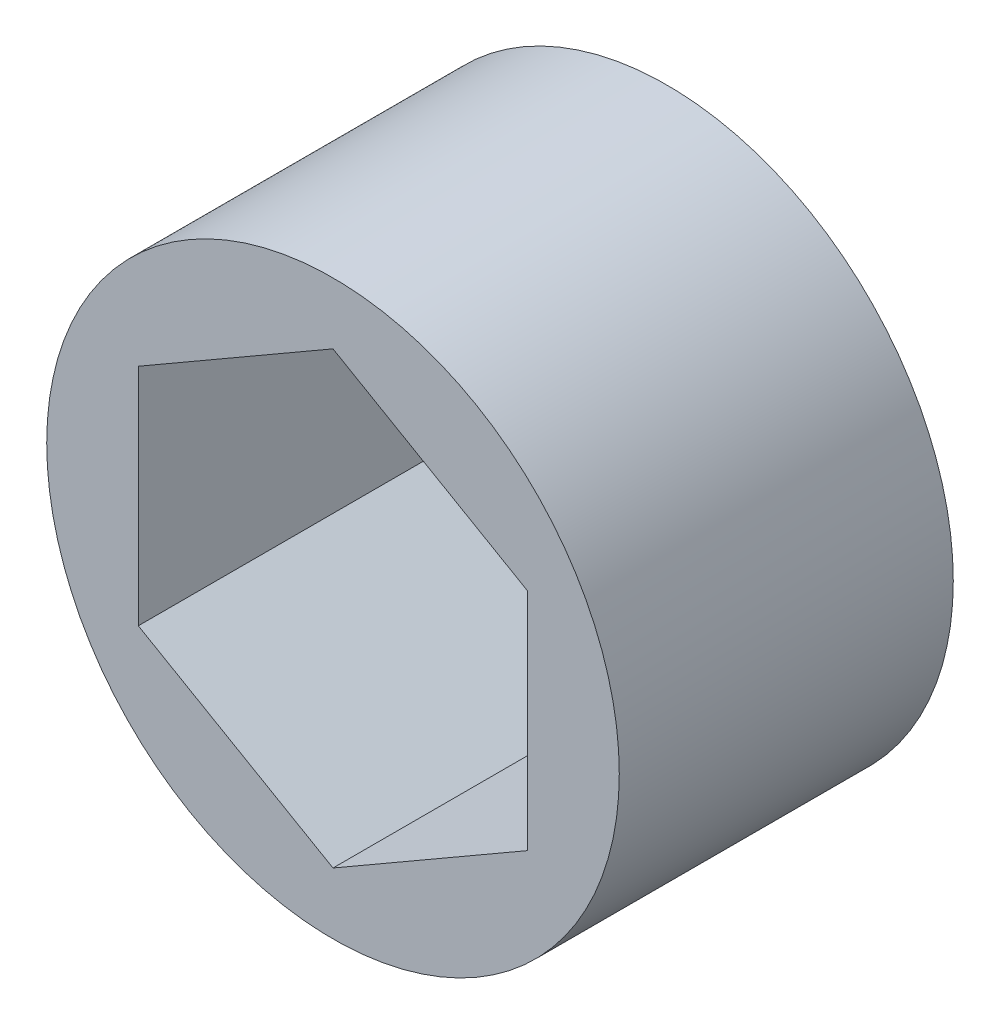
ISO-10303-21;
HEADER;
FILE_DESCRIPTION(('STEP AP214'),'2;1');
FILE_NAME('part.step','',(''),(''),'','','');
FILE_SCHEMA(('AUTOMOTIVE_DESIGN { 1 0 10303 214 1 1 1 1 }'));
ENDSEC;
DATA;
#1=APPLICATION_CONTEXT('core data for automotive mechanical design processes');
#2=APPLICATION_PROTOCOL_DEFINITION('international standard','automotive_design',2000,#1);
#3=PRODUCT_CONTEXT('',#1,'mechanical');
#4=PRODUCT('Part','Part','',(#3));
#5=PRODUCT_RELATED_PRODUCT_CATEGORY('part','',(#4));
#6=PRODUCT_DEFINITION_FORMATION('','',#4);
#7=PRODUCT_DEFINITION_CONTEXT('part definition',#1,'design');
#8=PRODUCT_DEFINITION('design','',#6,#7);
#9=PRODUCT_DEFINITION_SHAPE('','',#8);
#10=(LENGTH_UNIT() NAMED_UNIT(*) SI_UNIT(.MILLI.,.METRE.));
#11=(NAMED_UNIT(*) PLANE_ANGLE_UNIT() SI_UNIT($,.RADIAN.));
#12=(NAMED_UNIT(*) SI_UNIT($,.STERADIAN.) SOLID_ANGLE_UNIT());
#13=UNCERTAINTY_MEASURE_WITH_UNIT(LENGTH_MEASURE(1.E-05),#10,'distance_accuracy_value','');
#14=(GEOMETRIC_REPRESENTATION_CONTEXT(3) GLOBAL_UNCERTAINTY_ASSIGNED_CONTEXT((#13)) GLOBAL_UNIT_ASSIGNED_CONTEXT((#10,
#11,#12)) REPRESENTATION_CONTEXT('',''));
#15=CARTESIAN_POINT('',(0.,0.,0.));
#16=DIRECTION('',(0.,0.,1.));
#17=DIRECTION('',(1.,0.,0.));
#18=AXIS2_PLACEMENT_3D('',#15,#16,#17);
#19=CARTESIAN_POINT('',(0.,0.,5.55625));
#20=DIRECTION('',(0.,0.,1.));
#21=DIRECTION('',(1.,0.,0.));
#22=AXIS2_PLACEMENT_3D('',#19,#20,#21);
#23=PLANE('',#22);
#24=CARTESIAN_POINT('',(0.,0.,5.55625));
#25=DIRECTION('',(0.,0.,1.));
#26=DIRECTION('',(1.,0.,0.));
#27=AXIS2_PLACEMENT_3D('',#24,#25,#26);
#28=CIRCLE('',#27,9.525);
#29=CARTESIAN_POINT('',(9.525,0.,5.55625));
#30=VERTEX_POINT('',#29);
#31=EDGE_CURVE('E11',#30,#30,#28,.T.);
#32=ORIENTED_EDGE('',*,*,#31,.T.);
#33=EDGE_LOOP('',(#32));
#34=FACE_BOUND('',#33,.T.);
#35=DIRECTION('',(-0.866025403784438,-0.500000000000001,0.));
#36=VECTOR('',#35,1.);
#37=CARTESIAN_POINT('',(0.,7.47899538708241,5.55625));
#38=LINE('',#37,#36);
#39=CARTESIAN_POINT('',(0.,7.47899538708241,5.55625));
#40=VERTEX_POINT('',#39);
#41=CARTESIAN_POINT('',(-6.47700000000001,3.73949769354119,5.55625));
#42=VERTEX_POINT('',#41);
#43=EDGE_CURVE('E108',#40,#42,#38,.T.);
#44=ORIENTED_EDGE('',*,*,#43,.F.);
#45=DIRECTION('',(-0.866025403784441,0.499999999999995,0.));
#46=VECTOR('',#45,1.);
#47=CARTESIAN_POINT('',(6.47699999999996,3.73949769354128,5.55625));
#48=LINE('',#47,#46);
#49=CARTESIAN_POINT('',(6.47699999999996,3.73949769354128,5.55625));
#50=VERTEX_POINT('',#49);
#51=EDGE_CURVE('E99',#50,#40,#48,.T.);
#52=ORIENTED_EDGE('',*,*,#51,.F.);
#53=DIRECTION('',(0.,1.,0.));
#54=VECTOR('',#53,1.);
#55=CARTESIAN_POINT('',(6.47700000000003,-3.73949769354115,5.55625));
#56=LINE('',#55,#54);
#57=CARTESIAN_POINT('',(6.47700000000003,-3.73949769354115,5.55625));
#58=VERTEX_POINT('',#57);
#59=EDGE_CURVE('E133',#58,#50,#56,.T.);
#60=ORIENTED_EDGE('',*,*,#59,.F.);
#61=DIRECTION('',(0.866025403784435,0.500000000000007,0.));
#62=VECTOR('',#61,1.);
#63=CARTESIAN_POINT('',(0.,-7.47899538708241,5.55625));
#64=LINE('',#63,#62);
#65=CARTESIAN_POINT('',(0.,-7.47899538708241,5.55625));
#66=VERTEX_POINT('',#65);
#67=EDGE_CURVE('E130',#66,#58,#64,.T.);
#68=ORIENTED_EDGE('',*,*,#67,.F.);
#69=DIRECTION('',(0.866025403784441,-0.499999999999995,0.));
#70=VECTOR('',#69,1.);
#71=CARTESIAN_POINT('',(-6.47699999999998,-3.73949769354123,5.55625));
#72=LINE('',#71,#70);
#73=CARTESIAN_POINT('',(-6.47699999999998,-3.73949769354123,5.55625));
#74=VERTEX_POINT('',#73);
#75=EDGE_CURVE('E125',#74,#66,#72,.T.);
#76=ORIENTED_EDGE('',*,*,#75,.F.);
#77=DIRECTION('',(0.,-1.,0.));
#78=VECTOR('',#77,1.);
#79=CARTESIAN_POINT('',(-6.47700000000001,3.73949769354119,5.55625));
#80=LINE('',#79,#78);
#81=EDGE_CURVE('E121',#42,#74,#80,.T.);
#82=ORIENTED_EDGE('',*,*,#81,.F.);
#83=EDGE_LOOP('',(#44,#52,#60,#68,#76,#82));
#84=FACE_BOUND('',#83,.T.);
#85=ADVANCED_FACE('F45',(#34,#84),#23,.T.);
#86=CARTESIAN_POINT('',(0.,0.,-5.55625));
#87=DIRECTION('',(0.,0.,1.));
#88=DIRECTION('',(1.,0.,0.));
#89=AXIS2_PLACEMENT_3D('',#86,#87,#88);
#90=PLANE('',#89);
#91=CARTESIAN_POINT('',(0.,0.,-5.55625));
#92=DIRECTION('',(0.,0.,1.));
#93=DIRECTION('',(1.,0.,0.));
#94=AXIS2_PLACEMENT_3D('',#91,#92,#93);
#95=CIRCLE('',#94,9.525);
#96=CARTESIAN_POINT('',(9.525,0.,-5.55625));
#97=VERTEX_POINT('',#96);
#98=EDGE_CURVE('E49',#97,#97,#95,.T.);
#99=ORIENTED_EDGE('',*,*,#98,.F.);
#100=EDGE_LOOP('',(#99));
#101=FACE_BOUND('',#100,.T.);
#102=DIRECTION('',(-0.866025403784441,0.499999999999995,0.));
#103=VECTOR('',#102,1.);
#104=CARTESIAN_POINT('',(6.47699999999996,3.73949769354128,-5.55625));
#105=LINE('',#104,#103);
#106=CARTESIAN_POINT('',(6.47699999999996,3.73949769354128,-5.55625));
#107=VERTEX_POINT('',#106);
#108=CARTESIAN_POINT('',(0.,7.47899538708241,-5.55625));
#109=VERTEX_POINT('',#108);
#110=EDGE_CURVE('E69',#107,#109,#105,.T.);
#111=ORIENTED_EDGE('',*,*,#110,.T.);
#112=DIRECTION('',(-0.866025403784438,-0.500000000000001,0.));
#113=VECTOR('',#112,1.);
#114=CARTESIAN_POINT('',(0.,7.47899538708241,-5.55625));
#115=LINE('',#114,#113);
#116=CARTESIAN_POINT('',(-6.47700000000001,3.73949769354119,-5.55625));
#117=VERTEX_POINT('',#116);
#118=EDGE_CURVE('E115',#109,#117,#115,.T.);
#119=ORIENTED_EDGE('',*,*,#118,.T.);
#120=DIRECTION('',(0.,-1.,0.));
#121=VECTOR('',#120,1.);
#122=CARTESIAN_POINT('',(-6.47700000000001,3.73949769354119,-5.55625));
#123=LINE('',#122,#121);
#124=CARTESIAN_POINT('',(-6.47699999999998,-3.73949769354123,-5.55625));
#125=VERTEX_POINT('',#124);
#126=EDGE_CURVE('E140',#117,#125,#123,.T.);
#127=ORIENTED_EDGE('',*,*,#126,.T.);
#128=DIRECTION('',(0.866025403784441,-0.499999999999995,0.));
#129=VECTOR('',#128,1.);
#130=CARTESIAN_POINT('',(-6.47699999999998,-3.73949769354123,-5.55625));
#131=LINE('',#130,#129);
#132=CARTESIAN_POINT('',(0.,-7.47899538708241,-5.55625));
#133=VERTEX_POINT('',#132);
#134=EDGE_CURVE('E144',#125,#133,#131,.T.);
#135=ORIENTED_EDGE('',*,*,#134,.T.);
#136=DIRECTION('',(0.866025403784435,0.500000000000007,0.));
#137=VECTOR('',#136,1.);
#138=CARTESIAN_POINT('',(0.,-7.47899538708241,-5.55625));
#139=LINE('',#138,#137);
#140=CARTESIAN_POINT('',(6.47700000000003,-3.73949769354115,-5.55625));
#141=VERTEX_POINT('',#140);
#142=EDGE_CURVE('E148',#133,#141,#139,.T.);
#143=ORIENTED_EDGE('',*,*,#142,.T.);
#144=DIRECTION('',(0.,1.,0.));
#145=VECTOR('',#144,1.);
#146=CARTESIAN_POINT('',(6.47700000000003,-3.73949769354115,-5.55625));
#147=LINE('',#146,#145);
#148=EDGE_CURVE('E109',#141,#107,#147,.T.);
#149=ORIENTED_EDGE('',*,*,#148,.T.);
#150=EDGE_LOOP('',(#111,#119,#127,#135,#143,#149));
#151=FACE_BOUND('',#150,.T.);
#152=ADVANCED_FACE('F172',(#101,#151),#90,.F.);
#153=CARTESIAN_POINT('',(0.,0.,5.55625));
#154=DIRECTION('',(0.,0.,-1.));
#155=DIRECTION('',(-1.,0.,0.));
#156=AXIS2_PLACEMENT_3D('',#153,#154,#155);
#157=CYLINDRICAL_SURFACE('',#156,9.525);
#158=ORIENTED_EDGE('',*,*,#31,.F.);
#159=EDGE_LOOP('',(#158));
#160=FACE_BOUND('',#159,.T.);
#161=ORIENTED_EDGE('',*,*,#98,.T.);
#162=EDGE_LOOP('',(#161));
#163=FACE_BOUND('',#162,.T.);
#164=ADVANCED_FACE('F47',(#160,#163),#157,.T.);
#165=CARTESIAN_POINT('',(6.47699999999996,3.73949769354128,5.55625));
#166=DIRECTION('',(-0.499999999999995,-0.866025403784441,0.));
#167=DIRECTION('',(0.866025403784441,-0.499999999999995,0.));
#168=AXIS2_PLACEMENT_3D('',#165,#166,#167);
#169=PLANE('',#168);
#170=ORIENTED_EDGE('',*,*,#110,.F.);
#171=DIRECTION('',(0.,0.,-1.));
#172=VECTOR('',#171,1.);
#173=CARTESIAN_POINT('',(6.47699999999996,3.73949769354128,5.55625));
#174=LINE('',#173,#172);
#175=EDGE_CURVE('E103',#50,#107,#174,.T.);
#176=ORIENTED_EDGE('',*,*,#175,.F.);
#177=ORIENTED_EDGE('',*,*,#51,.T.);
#178=DIRECTION('',(0.,0.,-1.));
#179=VECTOR('',#178,1.);
#180=CARTESIAN_POINT('',(0.,7.47899538708241,5.55625));
#181=LINE('',#180,#179);
#182=EDGE_CURVE('E102',#40,#109,#181,.T.);
#183=ORIENTED_EDGE('',*,*,#182,.T.);
#184=EDGE_LOOP('',(#170,#176,#177,#183));
#185=FACE_BOUND('',#184,.T.);
#186=ADVANCED_FACE('F101',(#185),#169,.T.);
#187=CARTESIAN_POINT('',(0.,7.47899538708241,5.55625));
#188=DIRECTION('',(0.500000000000001,-0.866025403784438,0.));
#189=DIRECTION('',(0.866025403784438,0.500000000000001,0.));
#190=AXIS2_PLACEMENT_3D('',#187,#188,#189);
#191=PLANE('',#190);
#192=ORIENTED_EDGE('',*,*,#118,.F.);
#193=ORIENTED_EDGE('',*,*,#182,.F.);
#194=ORIENTED_EDGE('',*,*,#43,.T.);
#195=DIRECTION('',(0.,0.,-1.));
#196=VECTOR('',#195,1.);
#197=CARTESIAN_POINT('',(-6.47700000000001,3.73949769354119,5.55625));
#198=LINE('',#197,#196);
#199=EDGE_CURVE('E117',#42,#117,#198,.T.);
#200=ORIENTED_EDGE('',*,*,#199,.T.);
#201=EDGE_LOOP('',(#192,#193,#194,#200));
#202=FACE_BOUND('',#201,.T.);
#203=ADVANCED_FACE('F112',(#202),#191,.T.);
#204=CARTESIAN_POINT('',(-6.47700000000001,3.73949769354119,5.55625));
#205=DIRECTION('',(1.,0.,0.));
#206=DIRECTION('',(0.,1.,0.));
#207=AXIS2_PLACEMENT_3D('',#204,#205,#206);
#208=PLANE('',#207);
#209=ORIENTED_EDGE('',*,*,#126,.F.);
#210=ORIENTED_EDGE('',*,*,#199,.F.);
#211=ORIENTED_EDGE('',*,*,#81,.T.);
#212=DIRECTION('',(0.,0.,-1.));
#213=VECTOR('',#212,1.);
#214=CARTESIAN_POINT('',(-6.47699999999998,-3.73949769354123,5.55625));
#215=LINE('',#214,#213);
#216=EDGE_CURVE('E162',#74,#125,#215,.T.);
#217=ORIENTED_EDGE('',*,*,#216,.T.);
#218=EDGE_LOOP('',(#209,#210,#211,#217));
#219=FACE_BOUND('',#218,.T.);
#220=ADVANCED_FACE('F168',(#219),#208,.T.);
#221=CARTESIAN_POINT('',(-6.47699999999998,-3.73949769354123,5.55625));
#222=DIRECTION('',(0.499999999999995,0.866025403784442,0.));
#223=DIRECTION('',(-0.866025403784442,0.499999999999995,0.));
#224=AXIS2_PLACEMENT_3D('',#221,#222,#223);
#225=PLANE('',#224);
#226=ORIENTED_EDGE('',*,*,#134,.F.);
#227=ORIENTED_EDGE('',*,*,#216,.F.);
#228=ORIENTED_EDGE('',*,*,#75,.T.);
#229=DIRECTION('',(0.,0.,-1.));
#230=VECTOR('',#229,1.);
#231=CARTESIAN_POINT('',(0.,-7.47899538708241,5.55625));
#232=LINE('',#231,#230);
#233=EDGE_CURVE('E159',#66,#133,#232,.T.);
#234=ORIENTED_EDGE('',*,*,#233,.T.);
#235=EDGE_LOOP('',(#226,#227,#228,#234));
#236=FACE_BOUND('',#235,.T.);
#237=ADVANCED_FACE('F180',(#236),#225,.T.);
#238=CARTESIAN_POINT('',(0.,-7.47899538708241,5.55625));
#239=DIRECTION('',(-0.500000000000007,0.866025403784434,0.));
#240=DIRECTION('',(-0.866025403784435,-0.500000000000007,0.));
#241=AXIS2_PLACEMENT_3D('',#238,#239,#240);
#242=PLANE('',#241);
#243=ORIENTED_EDGE('',*,*,#142,.F.);
#244=ORIENTED_EDGE('',*,*,#233,.F.);
#245=ORIENTED_EDGE('',*,*,#67,.T.);
#246=DIRECTION('',(0.,0.,-1.));
#247=VECTOR('',#246,1.);
#248=CARTESIAN_POINT('',(6.47700000000003,-3.73949769354115,5.55625));
#249=LINE('',#248,#247);
#250=EDGE_CURVE('E61',#58,#141,#249,.T.);
#251=ORIENTED_EDGE('',*,*,#250,.T.);
#252=EDGE_LOOP('',(#243,#244,#245,#251));
#253=FACE_BOUND('',#252,.T.);
#254=ADVANCED_FACE('F178',(#253),#242,.T.);
#255=CARTESIAN_POINT('',(6.47700000000003,-3.73949769354115,5.55625));
#256=DIRECTION('',(-1.,0.,0.));
#257=DIRECTION('',(0.,-1.,0.));
#258=AXIS2_PLACEMENT_3D('',#255,#256,#257);
#259=PLANE('',#258);
#260=ORIENTED_EDGE('',*,*,#148,.F.);
#261=ORIENTED_EDGE('',*,*,#250,.F.);
#262=ORIENTED_EDGE('',*,*,#59,.T.);
#263=ORIENTED_EDGE('',*,*,#175,.T.);
#264=EDGE_LOOP('',(#260,#261,#262,#263));
#265=FACE_BOUND('',#264,.T.);
#266=ADVANCED_FACE('F174',(#265),#259,.T.);
#267=CLOSED_SHELL('',(#85,#152,#164,#186,#203,#220,#237,#254,#266));
#268=MANIFOLD_SOLID_BREP('B2',#267);
#269=ADVANCED_BREP_SHAPE_REPRESENTATION('',(#18,#268),#14);
#270=SHAPE_DEFINITION_REPRESENTATION(#9,#269);
ENDSEC;
END-ISO-10303-21;
